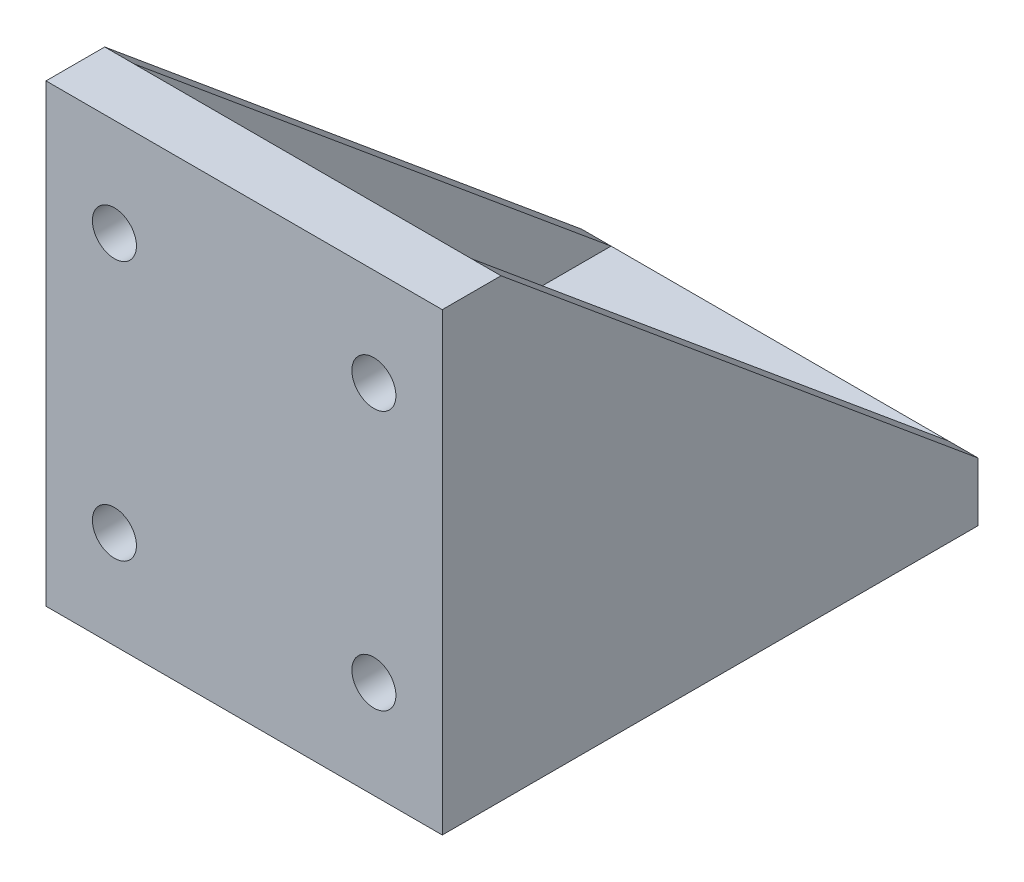
ISO-10303-21;
HEADER;
FILE_DESCRIPTION(('STEP AP214'),'2;1');
FILE_NAME('part.step','',(''),(''),'','','');
FILE_SCHEMA(('AUTOMOTIVE_DESIGN { 1 0 10303 214 1 1 1 1 }'));
ENDSEC;
DATA;
#1=APPLICATION_CONTEXT('core data for automotive mechanical design processes');
#2=APPLICATION_PROTOCOL_DEFINITION('international standard','automotive_design',2000,#1);
#3=PRODUCT_CONTEXT('',#1,'mechanical');
#4=PRODUCT('Part','Part','',(#3));
#5=PRODUCT_RELATED_PRODUCT_CATEGORY('part','',(#4));
#6=PRODUCT_DEFINITION_FORMATION('','',#4);
#7=PRODUCT_DEFINITION_CONTEXT('part definition',#1,'design');
#8=PRODUCT_DEFINITION('design','',#6,#7);
#9=PRODUCT_DEFINITION_SHAPE('','',#8);
#10=(LENGTH_UNIT() NAMED_UNIT(*) SI_UNIT(.MILLI.,.METRE.));
#11=(NAMED_UNIT(*) PLANE_ANGLE_UNIT() SI_UNIT($,.RADIAN.));
#12=(NAMED_UNIT(*) SI_UNIT($,.STERADIAN.) SOLID_ANGLE_UNIT());
#13=UNCERTAINTY_MEASURE_WITH_UNIT(LENGTH_MEASURE(1.E-05),#10,'distance_accuracy_value','');
#14=(GEOMETRIC_REPRESENTATION_CONTEXT(3) GLOBAL_UNCERTAINTY_ASSIGNED_CONTEXT((#13)) GLOBAL_UNIT_ASSIGNED_CONTEXT((#10,
#11,#12)) REPRESENTATION_CONTEXT('',''));
#15=CARTESIAN_POINT('',(0.,0.,0.));
#16=DIRECTION('',(0.,0.,1.));
#17=DIRECTION('',(1.,0.,0.));
#18=AXIS2_PLACEMENT_3D('',#15,#16,#17);
#19=CARTESIAN_POINT('',(-27.,-23.,-73.));
#20=DIRECTION('',(0.,0.769190373051951,-0.639019694535466));
#21=DIRECTION('',(0.,0.639019694535466,0.769190373051951));
#22=AXIS2_PLACEMENT_3D('',#19,#20,#21);
#23=PLANE('',#22);
#24=DIRECTION('',(0.,0.639019694535466,0.769190373051951));
#25=VECTOR('',#24,1.);
#26=CARTESIAN_POINT('',(-23.,-23.,-73.));
#27=LINE('',#26,#25);
#28=CARTESIAN_POINT('',(-23.,-23.,-73.));
#29=VERTEX_POINT('',#28);
#30=CARTESIAN_POINT('',(-23.,31.,-8.));
#31=VERTEX_POINT('',#30);
#32=EDGE_CURVE('E11',#29,#31,#27,.T.);
#33=ORIENTED_EDGE('',*,*,#32,.F.);
#34=DIRECTION('',(1.,0.,0.));
#35=VECTOR('',#34,1.);
#36=CARTESIAN_POINT('',(-27.,-23.,-73.));
#37=LINE('',#36,#35);
#38=CARTESIAN_POINT('',(-27.,-23.,-73.));
#39=VERTEX_POINT('',#38);
#40=EDGE_CURVE('E130',#39,#29,#37,.T.);
#41=ORIENTED_EDGE('',*,*,#40,.F.);
#42=DIRECTION('',(0.,0.639019694535466,0.769190373051951));
#43=VECTOR('',#42,1.);
#44=CARTESIAN_POINT('',(-27.,-23.,-73.));
#45=LINE('',#44,#43);
#46=CARTESIAN_POINT('',(-27.,31.,-7.99999999999999));
#47=VERTEX_POINT('',#46);
#48=EDGE_CURVE('E155',#39,#47,#45,.T.);
#49=ORIENTED_EDGE('',*,*,#48,.T.);
#50=DIRECTION('',(1.,0.,0.));
#51=VECTOR('',#50,1.);
#52=CARTESIAN_POINT('',(-27.,31.,-7.99999999999999));
#53=LINE('',#52,#51);
#54=EDGE_CURVE('E69',#47,#31,#53,.T.);
#55=ORIENTED_EDGE('',*,*,#54,.T.);
#56=EDGE_LOOP('',(#33,#41,#49,#55));
#57=FACE_BOUND('',#56,.T.);
#58=ADVANCED_FACE('F43',(#57),#23,.T.);
#59=CARTESIAN_POINT('',(-27.,31.,-7.99999999999999));
#60=DIRECTION('',(0.,1.,0.));
#61=DIRECTION('',(0.,0.,1.));
#62=AXIS2_PLACEMENT_3D('',#59,#60,#61);
#63=PLANE('',#62);
#64=DIRECTION('',(1.,0.,0.));
#65=VECTOR('',#64,1.);
#66=CARTESIAN_POINT('',(-27.,31.,0.));
#67=LINE('',#66,#65);
#68=CARTESIAN_POINT('',(-27.,31.,0.));
#69=VERTEX_POINT('',#68);
#70=CARTESIAN_POINT('',(27.,31.,0.));
#71=VERTEX_POINT('',#70);
#72=EDGE_CURVE('E152',#69,#71,#67,.T.);
#73=ORIENTED_EDGE('',*,*,#72,.T.);
#74=DIRECTION('',(0.,0.,1.));
#75=VECTOR('',#74,1.);
#76=CARTESIAN_POINT('',(27.,31.,-7.99999999999999));
#77=LINE('',#76,#75);
#78=CARTESIAN_POINT('',(27.,31.,-7.99999999999999));
#79=VERTEX_POINT('',#78);
#80=EDGE_CURVE('E220',#79,#71,#77,.T.);
#81=ORIENTED_EDGE('',*,*,#80,.F.);
#82=CARTESIAN_POINT('',(23.,31.,-8.));
#83=VERTEX_POINT('',#82);
#84=EDGE_CURVE('E137',#83,#79,#53,.T.);
#85=ORIENTED_EDGE('',*,*,#84,.F.);
#86=DIRECTION('',(-1.,0.,0.));
#87=VECTOR('',#86,1.);
#88=CARTESIAN_POINT('',(-23.,31.,-8.));
#89=LINE('',#88,#87);
#90=EDGE_CURVE('E126',#83,#31,#89,.T.);
#91=ORIENTED_EDGE('',*,*,#90,.T.);
#92=ORIENTED_EDGE('',*,*,#54,.F.);
#93=DIRECTION('',(0.,0.,1.));
#94=VECTOR('',#93,1.);
#95=CARTESIAN_POINT('',(-27.,31.,-7.99999999999999));
#96=LINE('',#95,#94);
#97=EDGE_CURVE('E241',#47,#69,#96,.T.);
#98=ORIENTED_EDGE('',*,*,#97,.T.);
#99=EDGE_LOOP('',(#73,#81,#85,#91,#92,#98));
#100=FACE_BOUND('',#99,.T.);
#101=ADVANCED_FACE('F45',(#100),#63,.T.);
#102=DIRECTION('',(0.,-0.639019694535466,-0.769190373051951));
#103=VECTOR('',#102,1.);
#104=CARTESIAN_POINT('',(23.,-23.,-73.));
#105=LINE('',#104,#103);
#106=CARTESIAN_POINT('',(23.,-23.,-73.));
#107=VERTEX_POINT('',#106);
#108=EDGE_CURVE('E53',#83,#107,#105,.T.);
#109=ORIENTED_EDGE('',*,*,#108,.F.);
#110=ORIENTED_EDGE('',*,*,#84,.T.);
#111=DIRECTION('',(0.,0.639019694535466,0.769190373051951));
#112=VECTOR('',#111,1.);
#113=CARTESIAN_POINT('',(27.,-23.,-73.));
#114=LINE('',#113,#112);
#115=CARTESIAN_POINT('',(27.,-23.,-73.));
#116=VERTEX_POINT('',#115);
#117=EDGE_CURVE('E237',#116,#79,#114,.T.);
#118=ORIENTED_EDGE('',*,*,#117,.F.);
#119=EDGE_CURVE('E138',#107,#116,#37,.T.);
#120=ORIENTED_EDGE('',*,*,#119,.F.);
#121=EDGE_LOOP('',(#109,#110,#118,#120));
#122=FACE_BOUND('',#121,.T.);
#123=ADVANCED_FACE('F269',(#122),#23,.T.);
#124=CARTESIAN_POINT('',(-27.,-31.,-73.));
#125=DIRECTION('',(0.,0.,-1.));
#126=DIRECTION('',(-1.,0.,0.));
#127=AXIS2_PLACEMENT_3D('',#124,#125,#126);
#128=PLANE('',#127);
#129=ORIENTED_EDGE('',*,*,#40,.T.);
#130=DIRECTION('',(1.,0.,0.));
#131=VECTOR('',#130,1.);
#132=CARTESIAN_POINT('',(-23.,-23.,-73.));
#133=LINE('',#132,#131);
#134=EDGE_CURVE('E119',#29,#107,#133,.T.);
#135=ORIENTED_EDGE('',*,*,#134,.T.);
#136=ORIENTED_EDGE('',*,*,#119,.T.);
#137=DIRECTION('',(0.,1.,0.));
#138=VECTOR('',#137,1.);
#139=CARTESIAN_POINT('',(27.,-31.,-73.));
#140=LINE('',#139,#138);
#141=CARTESIAN_POINT('',(27.,-31.,-73.));
#142=VERTEX_POINT('',#141);
#143=EDGE_CURVE('E233',#142,#116,#140,.T.);
#144=ORIENTED_EDGE('',*,*,#143,.F.);
#145=DIRECTION('',(1.,0.,0.));
#146=VECTOR('',#145,1.);
#147=CARTESIAN_POINT('',(-27.,-31.,-73.));
#148=LINE('',#147,#146);
#149=CARTESIAN_POINT('',(-27.,-31.,-73.));
#150=VERTEX_POINT('',#149);
#151=EDGE_CURVE('E144',#150,#142,#148,.T.);
#152=ORIENTED_EDGE('',*,*,#151,.F.);
#153=DIRECTION('',(0.,1.,0.));
#154=VECTOR('',#153,1.);
#155=CARTESIAN_POINT('',(-27.,-31.,-73.));
#156=LINE('',#155,#154);
#157=EDGE_CURVE('E134',#150,#39,#156,.T.);
#158=ORIENTED_EDGE('',*,*,#157,.T.);
#159=EDGE_LOOP('',(#129,#135,#136,#144,#152,#158));
#160=FACE_BOUND('',#159,.T.);
#161=ADVANCED_FACE('F132',(#160),#128,.T.);
#162=CARTESIAN_POINT('',(-27.,-31.,-73.));
#163=DIRECTION('',(0.,-1.,0.));
#164=DIRECTION('',(0.,0.,-1.));
#165=AXIS2_PLACEMENT_3D('',#162,#163,#164);
#166=PLANE('',#165);
#167=CARTESIAN_POINT('',(0.,-31.,-14.));
#168=DIRECTION('',(0.,1.,0.));
#169=DIRECTION('',(0.,0.,-1.));
#170=AXIS2_PLACEMENT_3D('',#167,#168,#169);
#171=CIRCLE('',#170,2.);
#172=CARTESIAN_POINT('',(0.,-31.,-16.));
#173=VERTEX_POINT('',#172);
#174=EDGE_CURVE('E180',#173,#173,#171,.T.);
#175=ORIENTED_EDGE('',*,*,#174,.T.);
#176=EDGE_LOOP('',(#175));
#177=FACE_BOUND('',#176,.T.);
#178=CARTESIAN_POINT('',(0.,-31.,-59.));
#179=DIRECTION('',(0.,1.,0.));
#180=DIRECTION('',(0.,0.,-1.));
#181=AXIS2_PLACEMENT_3D('',#178,#179,#180);
#182=CIRCLE('',#181,2.);
#183=CARTESIAN_POINT('',(0.,-31.,-61.));
#184=VERTEX_POINT('',#183);
#185=EDGE_CURVE('E353',#184,#184,#182,.T.);
#186=ORIENTED_EDGE('',*,*,#185,.T.);
#187=EDGE_LOOP('',(#186));
#188=FACE_BOUND('',#187,.T.);
#189=CARTESIAN_POINT('',(18.,-31.,-36.5));
#190=DIRECTION('',(0.,1.,0.));
#191=DIRECTION('',(0.,0.,-1.));
#192=AXIS2_PLACEMENT_3D('',#189,#190,#191);
#193=CIRCLE('',#192,2.);
#194=CARTESIAN_POINT('',(18.,-31.,-38.5));
#195=VERTEX_POINT('',#194);
#196=EDGE_CURVE('E357',#195,#195,#193,.T.);
#197=ORIENTED_EDGE('',*,*,#196,.T.);
#198=EDGE_LOOP('',(#197));
#199=FACE_BOUND('',#198,.T.);
#200=CARTESIAN_POINT('',(-18.,-31.,-36.5));
#201=DIRECTION('',(0.,1.,0.));
#202=DIRECTION('',(0.,0.,-1.));
#203=AXIS2_PLACEMENT_3D('',#200,#201,#202);
#204=CIRCLE('',#203,2.);
#205=CARTESIAN_POINT('',(-18.,-31.,-38.5));
#206=VERTEX_POINT('',#205);
#207=EDGE_CURVE('E363',#206,#206,#204,.T.);
#208=ORIENTED_EDGE('',*,*,#207,.T.);
#209=EDGE_LOOP('',(#208));
#210=FACE_BOUND('',#209,.T.);
#211=ORIENTED_EDGE('',*,*,#151,.T.);
#212=DIRECTION('',(0.,0.,-1.));
#213=VECTOR('',#212,1.);
#214=CARTESIAN_POINT('',(27.,-31.,-73.));
#215=LINE('',#214,#213);
#216=CARTESIAN_POINT('',(27.,-31.,0.));
#217=VERTEX_POINT('',#216);
#218=EDGE_CURVE('E229',#217,#142,#215,.T.);
#219=ORIENTED_EDGE('',*,*,#218,.F.);
#220=DIRECTION('',(1.,0.,0.));
#221=VECTOR('',#220,1.);
#222=CARTESIAN_POINT('',(-27.,-31.,0.));
#223=LINE('',#222,#221);
#224=CARTESIAN_POINT('',(-27.,-31.,0.));
#225=VERTEX_POINT('',#224);
#226=EDGE_CURVE('E149',#225,#217,#223,.T.);
#227=ORIENTED_EDGE('',*,*,#226,.F.);
#228=DIRECTION('',(0.,0.,-1.));
#229=VECTOR('',#228,1.);
#230=CARTESIAN_POINT('',(-27.,-31.,-73.));
#231=LINE('',#230,#229);
#232=EDGE_CURVE('E248',#225,#150,#231,.T.);
#233=ORIENTED_EDGE('',*,*,#232,.T.);
#234=EDGE_LOOP('',(#211,#219,#227,#233));
#235=FACE_BOUND('',#234,.T.);
#236=ADVANCED_FACE('F294',(#177,#188,#199,#210,#235),#166,.T.);
#237=CARTESIAN_POINT('',(-27.,31.,0.));
#238=DIRECTION('',(0.,0.,1.));
#239=DIRECTION('',(0.,-1.,0.));
#240=AXIS2_PLACEMENT_3D('',#237,#238,#239);
#241=PLANE('',#240);
#242=CARTESIAN_POINT('',(17.6776695296636,17.6776695296638,0.));
#243=DIRECTION('',(0.,0.,-1.));
#244=DIRECTION('',(-1.,0.,0.));
#245=AXIS2_PLACEMENT_3D('',#242,#243,#244);
#246=CIRCLE('',#245,3.);
#247=CARTESIAN_POINT('',(14.6776695296636,17.6776695296638,0.));
#248=VERTEX_POINT('',#247);
#249=EDGE_CURVE('E192',#248,#248,#246,.T.);
#250=ORIENTED_EDGE('',*,*,#249,.T.);
#251=EDGE_LOOP('',(#250));
#252=FACE_BOUND('',#251,.T.);
#253=CARTESIAN_POINT('',(17.6776695296638,-17.6776695296636,0.));
#254=DIRECTION('',(0.,0.,-1.));
#255=DIRECTION('',(-1.,0.,0.));
#256=AXIS2_PLACEMENT_3D('',#253,#254,#255);
#257=CIRCLE('',#256,2.99999999999999);
#258=CARTESIAN_POINT('',(14.6776695296638,-17.6776695296636,0.));
#259=VERTEX_POINT('',#258);
#260=EDGE_CURVE('E197',#259,#259,#257,.T.);
#261=ORIENTED_EDGE('',*,*,#260,.T.);
#262=EDGE_LOOP('',(#261));
#263=FACE_BOUND('',#262,.T.);
#264=CARTESIAN_POINT('',(-17.6776695296636,-17.6776695296638,0.));
#265=DIRECTION('',(0.,0.,-1.));
#266=DIRECTION('',(-1.,0.,0.));
#267=AXIS2_PLACEMENT_3D('',#264,#265,#266);
#268=CIRCLE('',#267,3.);
#269=CARTESIAN_POINT('',(-20.6776695296636,-17.6776695296638,0.));
#270=VERTEX_POINT('',#269);
#271=EDGE_CURVE('E204',#270,#270,#268,.T.);
#272=ORIENTED_EDGE('',*,*,#271,.T.);
#273=EDGE_LOOP('',(#272));
#274=FACE_BOUND('',#273,.T.);
#275=CARTESIAN_POINT('',(-17.6776695296638,17.6776695296636,0.));
#276=DIRECTION('',(0.,0.,-1.));
#277=DIRECTION('',(-1.,0.,0.));
#278=AXIS2_PLACEMENT_3D('',#275,#276,#277);
#279=CIRCLE('',#278,3.);
#280=CARTESIAN_POINT('',(-20.6776695296638,17.6776695296636,0.));
#281=VERTEX_POINT('',#280);
#282=EDGE_CURVE('E163',#281,#281,#279,.T.);
#283=ORIENTED_EDGE('',*,*,#282,.T.);
#284=EDGE_LOOP('',(#283));
#285=FACE_BOUND('',#284,.T.);
#286=ORIENTED_EDGE('',*,*,#226,.T.);
#287=DIRECTION('',(0.,-1.,0.));
#288=VECTOR('',#287,1.);
#289=CARTESIAN_POINT('',(27.,31.,0.));
#290=LINE('',#289,#288);
#291=EDGE_CURVE('E225',#71,#217,#290,.T.);
#292=ORIENTED_EDGE('',*,*,#291,.F.);
#293=ORIENTED_EDGE('',*,*,#72,.F.);
#294=DIRECTION('',(0.,-1.,0.));
#295=VECTOR('',#294,1.);
#296=CARTESIAN_POINT('',(-27.,31.,0.));
#297=LINE('',#296,#295);
#298=EDGE_CURVE('E244',#69,#225,#297,.T.);
#299=ORIENTED_EDGE('',*,*,#298,.T.);
#300=EDGE_LOOP('',(#286,#292,#293,#299));
#301=FACE_BOUND('',#300,.T.);
#302=ADVANCED_FACE('F260',(#252,#263,#274,#285,#301),#241,.T.);
#303=CARTESIAN_POINT('',(-27.,0.,0.));
#304=DIRECTION('',(1.,0.,0.));
#305=DIRECTION('',(0.,0.,-1.));
#306=AXIS2_PLACEMENT_3D('',#303,#304,#305);
#307=PLANE('',#306);
#308=ORIENTED_EDGE('',*,*,#97,.F.);
#309=ORIENTED_EDGE('',*,*,#48,.F.);
#310=ORIENTED_EDGE('',*,*,#157,.F.);
#311=ORIENTED_EDGE('',*,*,#232,.F.);
#312=ORIENTED_EDGE('',*,*,#298,.F.);
#313=EDGE_LOOP('',(#308,#309,#310,#311,#312));
#314=FACE_BOUND('',#313,.T.);
#315=ADVANCED_FACE('F253',(#314),#307,.F.);
#316=CARTESIAN_POINT('',(27.,0.,0.));
#317=DIRECTION('',(1.,0.,0.));
#318=DIRECTION('',(0.,0.,-1.));
#319=AXIS2_PLACEMENT_3D('',#316,#317,#318);
#320=PLANE('',#319);
#321=ORIENTED_EDGE('',*,*,#80,.T.);
#322=ORIENTED_EDGE('',*,*,#291,.T.);
#323=ORIENTED_EDGE('',*,*,#218,.T.);
#324=ORIENTED_EDGE('',*,*,#143,.T.);
#325=ORIENTED_EDGE('',*,*,#117,.T.);
#326=EDGE_LOOP('',(#321,#322,#323,#324,#325));
#327=FACE_BOUND('',#326,.T.);
#328=ADVANCED_FACE('F263',(#327),#320,.T.);
#329=CARTESIAN_POINT('',(-23.,31.,-73.));
#330=DIRECTION('',(-1.,0.,0.));
#331=DIRECTION('',(0.,-1.,0.));
#332=AXIS2_PLACEMENT_3D('',#329,#330,#331);
#333=PLANE('',#332);
#334=ORIENTED_EDGE('',*,*,#32,.T.);
#335=DIRECTION('',(0.,-1.,0.));
#336=VECTOR('',#335,1.);
#337=CARTESIAN_POINT('',(-23.,31.,-8.));
#338=LINE('',#337,#336);
#339=CARTESIAN_POINT('',(-23.,-23.,-8.));
#340=VERTEX_POINT('',#339);
#341=EDGE_CURVE('E116',#31,#340,#338,.T.);
#342=ORIENTED_EDGE('',*,*,#341,.T.);
#343=DIRECTION('',(0.,0.,1.));
#344=VECTOR('',#343,1.);
#345=CARTESIAN_POINT('',(-23.,-23.,-73.));
#346=LINE('',#345,#344);
#347=EDGE_CURVE('E112',#29,#340,#346,.T.);
#348=ORIENTED_EDGE('',*,*,#347,.F.);
#349=EDGE_LOOP('',(#334,#342,#348));
#350=FACE_BOUND('',#349,.T.);
#351=ADVANCED_FACE('F113',(#350),#333,.F.);
#352=CARTESIAN_POINT('',(23.,31.,-73.));
#353=DIRECTION('',(1.,0.,0.));
#354=DIRECTION('',(0.,1.,0.));
#355=AXIS2_PLACEMENT_3D('',#352,#353,#354);
#356=PLANE('',#355);
#357=ORIENTED_EDGE('',*,*,#108,.T.);
#358=DIRECTION('',(0.,0.,1.));
#359=VECTOR('',#358,1.);
#360=CARTESIAN_POINT('',(23.,-23.,-73.));
#361=LINE('',#360,#359);
#362=CARTESIAN_POINT('',(23.,-23.,-8.));
#363=VERTEX_POINT('',#362);
#364=EDGE_CURVE('E61',#107,#363,#361,.T.);
#365=ORIENTED_EDGE('',*,*,#364,.T.);
#366=DIRECTION('',(0.,1.,0.));
#367=VECTOR('',#366,1.);
#368=CARTESIAN_POINT('',(23.,31.,-8.));
#369=LINE('',#368,#367);
#370=EDGE_CURVE('E215',#363,#83,#369,.T.);
#371=ORIENTED_EDGE('',*,*,#370,.T.);
#372=EDGE_LOOP('',(#357,#365,#371));
#373=FACE_BOUND('',#372,.T.);
#374=ADVANCED_FACE('F275',(#373),#356,.F.);
#375=CARTESIAN_POINT('',(-23.,-23.,-73.));
#376=DIRECTION('',(0.,-1.,0.));
#377=DIRECTION('',(0.,0.,-1.));
#378=AXIS2_PLACEMENT_3D('',#375,#376,#377);
#379=PLANE('',#378);
#380=CARTESIAN_POINT('',(0.,-23.,-14.));
#381=DIRECTION('',(0.,-1.,0.));
#382=DIRECTION('',(0.,0.,-1.));
#383=AXIS2_PLACEMENT_3D('',#380,#381,#382);
#384=CIRCLE('',#383,2.);
#385=CARTESIAN_POINT('',(0.,-23.,-16.));
#386=VERTEX_POINT('',#385);
#387=EDGE_CURVE('E47',#386,#386,#384,.F.);
#388=ORIENTED_EDGE('',*,*,#387,.F.);
#389=EDGE_LOOP('',(#388));
#390=FACE_BOUND('',#389,.T.);
#391=CARTESIAN_POINT('',(0.,-23.,-59.));
#392=DIRECTION('',(0.,-1.,0.));
#393=DIRECTION('',(0.,0.,-1.));
#394=AXIS2_PLACEMENT_3D('',#391,#392,#393);
#395=CIRCLE('',#394,2.);
#396=CARTESIAN_POINT('',(0.,-23.,-61.));
#397=VERTEX_POINT('',#396);
#398=EDGE_CURVE('E183',#397,#397,#395,.F.);
#399=ORIENTED_EDGE('',*,*,#398,.F.);
#400=EDGE_LOOP('',(#399));
#401=FACE_BOUND('',#400,.T.);
#402=CARTESIAN_POINT('',(18.,-23.,-36.5));
#403=DIRECTION('',(0.,-1.,0.));
#404=DIRECTION('',(0.,0.,-1.));
#405=AXIS2_PLACEMENT_3D('',#402,#403,#404);
#406=CIRCLE('',#405,2.);
#407=CARTESIAN_POINT('',(18.,-23.,-38.5));
#408=VERTEX_POINT('',#407);
#409=EDGE_CURVE('E179',#408,#408,#406,.F.);
#410=ORIENTED_EDGE('',*,*,#409,.F.);
#411=EDGE_LOOP('',(#410));
#412=FACE_BOUND('',#411,.T.);
#413=CARTESIAN_POINT('',(-18.,-23.,-36.5));
#414=DIRECTION('',(0.,-1.,0.));
#415=DIRECTION('',(0.,0.,-1.));
#416=AXIS2_PLACEMENT_3D('',#413,#414,#415);
#417=CIRCLE('',#416,2.);
#418=CARTESIAN_POINT('',(-18.,-23.,-38.5));
#419=VERTEX_POINT('',#418);
#420=EDGE_CURVE('E175',#419,#419,#417,.F.);
#421=ORIENTED_EDGE('',*,*,#420,.F.);
#422=EDGE_LOOP('',(#421));
#423=FACE_BOUND('',#422,.T.);
#424=DIRECTION('',(1.,0.,0.));
#425=VECTOR('',#424,1.);
#426=CARTESIAN_POINT('',(-23.,-23.,-8.));
#427=LINE('',#426,#425);
#428=EDGE_CURVE('E212',#340,#363,#427,.T.);
#429=ORIENTED_EDGE('',*,*,#428,.T.);
#430=ORIENTED_EDGE('',*,*,#364,.F.);
#431=ORIENTED_EDGE('',*,*,#134,.F.);
#432=ORIENTED_EDGE('',*,*,#347,.T.);
#433=EDGE_LOOP('',(#429,#430,#431,#432));
#434=FACE_BOUND('',#433,.T.);
#435=ADVANCED_FACE('F122',(#390,#401,#412,#423,#434),#379,.F.);
#436=CARTESIAN_POINT('',(0.,0.,-8.));
#437=DIRECTION('',(0.,0.,1.));
#438=DIRECTION('',(1.,0.,0.));
#439=AXIS2_PLACEMENT_3D('',#436,#437,#438);
#440=PLANE('',#439);
#441=CARTESIAN_POINT('',(17.6776695296636,17.6776695296638,-8.00000000000001));
#442=DIRECTION('',(0.,0.,1.));
#443=DIRECTION('',(1.,0.,0.));
#444=AXIS2_PLACEMENT_3D('',#441,#442,#443);
#445=CIRCLE('',#444,3.);
#446=CARTESIAN_POINT('',(20.6776695296636,17.6776695296638,-8.00000000000001));
#447=VERTEX_POINT('',#446);
#448=EDGE_CURVE('E171',#447,#447,#445,.F.);
#449=ORIENTED_EDGE('',*,*,#448,.F.);
#450=EDGE_LOOP('',(#449));
#451=FACE_BOUND('',#450,.T.);
#452=CARTESIAN_POINT('',(17.6776695296638,-17.6776695296636,-8.00000000000001));
#453=DIRECTION('',(0.,0.,1.));
#454=DIRECTION('',(1.,0.,0.));
#455=AXIS2_PLACEMENT_3D('',#452,#453,#454);
#456=CIRCLE('',#455,2.99999999999999);
#457=CARTESIAN_POINT('',(20.6776695296638,-17.6776695296636,-8.00000000000001));
#458=VERTEX_POINT('',#457);
#459=EDGE_CURVE('E167',#458,#458,#456,.F.);
#460=ORIENTED_EDGE('',*,*,#459,.F.);
#461=EDGE_LOOP('',(#460));
#462=FACE_BOUND('',#461,.T.);
#463=CARTESIAN_POINT('',(-17.6776695296636,-17.6776695296638,-8.00000000000001));
#464=DIRECTION('',(0.,0.,1.));
#465=DIRECTION('',(1.,0.,0.));
#466=AXIS2_PLACEMENT_3D('',#463,#464,#465);
#467=CIRCLE('',#466,3.);
#468=CARTESIAN_POINT('',(-14.6776695296636,-17.6776695296638,-8.00000000000001));
#469=VERTEX_POINT('',#468);
#470=EDGE_CURVE('E162',#469,#469,#467,.F.);
#471=ORIENTED_EDGE('',*,*,#470,.F.);
#472=EDGE_LOOP('',(#471));
#473=FACE_BOUND('',#472,.T.);
#474=CARTESIAN_POINT('',(-17.6776695296638,17.6776695296636,-8.00000000000001));
#475=DIRECTION('',(0.,0.,1.));
#476=DIRECTION('',(1.,0.,0.));
#477=AXIS2_PLACEMENT_3D('',#474,#475,#476);
#478=CIRCLE('',#477,3.);
#479=CARTESIAN_POINT('',(-14.6776695296638,17.6776695296636,-8.00000000000001));
#480=VERTEX_POINT('',#479);
#481=EDGE_CURVE('E158',#480,#480,#478,.F.);
#482=ORIENTED_EDGE('',*,*,#481,.F.);
#483=EDGE_LOOP('',(#482));
#484=FACE_BOUND('',#483,.T.);
#485=ORIENTED_EDGE('',*,*,#341,.F.);
#486=ORIENTED_EDGE('',*,*,#90,.F.);
#487=ORIENTED_EDGE('',*,*,#370,.F.);
#488=ORIENTED_EDGE('',*,*,#428,.F.);
#489=EDGE_LOOP('',(#485,#486,#487,#488));
#490=FACE_BOUND('',#489,.T.);
#491=ADVANCED_FACE('F273',(#451,#462,#473,#484,#490),#440,.F.);
#492=CARTESIAN_POINT('',(-17.6776695296638,17.6776695296636,-73.));
#493=DIRECTION('',(0.,0.,1.));
#494=DIRECTION('',(1.,0.,0.));
#495=AXIS2_PLACEMENT_3D('',#492,#493,#494);
#496=CYLINDRICAL_SURFACE('',#495,3.);
#497=ORIENTED_EDGE('',*,*,#282,.F.);
#498=EDGE_LOOP('',(#497));
#499=FACE_BOUND('',#498,.T.);
#500=ORIENTED_EDGE('',*,*,#481,.T.);
#501=EDGE_LOOP('',(#500));
#502=FACE_BOUND('',#501,.T.);
#503=ADVANCED_FACE('F310',(#499,#502),#496,.F.);
#504=CARTESIAN_POINT('',(-17.6776695296636,-17.6776695296638,-73.));
#505=DIRECTION('',(0.,0.,1.));
#506=DIRECTION('',(1.,0.,0.));
#507=AXIS2_PLACEMENT_3D('',#504,#505,#506);
#508=CYLINDRICAL_SURFACE('',#507,3.);
#509=ORIENTED_EDGE('',*,*,#271,.F.);
#510=EDGE_LOOP('',(#509));
#511=FACE_BOUND('',#510,.T.);
#512=ORIENTED_EDGE('',*,*,#470,.T.);
#513=EDGE_LOOP('',(#512));
#514=FACE_BOUND('',#513,.T.);
#515=ADVANCED_FACE('F313',(#511,#514),#508,.F.);
#516=CARTESIAN_POINT('',(17.6776695296638,-17.6776695296636,-73.));
#517=DIRECTION('',(0.,0.,1.));
#518=DIRECTION('',(1.,0.,0.));
#519=AXIS2_PLACEMENT_3D('',#516,#517,#518);
#520=CYLINDRICAL_SURFACE('',#519,2.99999999999999);
#521=ORIENTED_EDGE('',*,*,#260,.F.);
#522=EDGE_LOOP('',(#521));
#523=FACE_BOUND('',#522,.T.);
#524=ORIENTED_EDGE('',*,*,#459,.T.);
#525=EDGE_LOOP('',(#524));
#526=FACE_BOUND('',#525,.T.);
#527=ADVANCED_FACE('F327',(#523,#526),#520,.F.);
#528=CARTESIAN_POINT('',(17.6776695296636,17.6776695296638,-73.));
#529=DIRECTION('',(0.,0.,1.));
#530=DIRECTION('',(1.,0.,0.));
#531=AXIS2_PLACEMENT_3D('',#528,#529,#530);
#532=CYLINDRICAL_SURFACE('',#531,3.);
#533=ORIENTED_EDGE('',*,*,#249,.F.);
#534=EDGE_LOOP('',(#533));
#535=FACE_BOUND('',#534,.T.);
#536=ORIENTED_EDGE('',*,*,#448,.T.);
#537=EDGE_LOOP('',(#536));
#538=FACE_BOUND('',#537,.T.);
#539=ADVANCED_FACE('F323',(#535,#538),#532,.F.);
#540=CARTESIAN_POINT('',(-18.,-21.,-36.5));
#541=DIRECTION('',(0.,-1.,0.));
#542=DIRECTION('',(0.,0.,-1.));
#543=AXIS2_PLACEMENT_3D('',#540,#541,#542);
#544=CYLINDRICAL_SURFACE('',#543,2.);
#545=ORIENTED_EDGE('',*,*,#207,.F.);
#546=EDGE_LOOP('',(#545));
#547=FACE_BOUND('',#546,.T.);
#548=ORIENTED_EDGE('',*,*,#420,.T.);
#549=EDGE_LOOP('',(#548));
#550=FACE_BOUND('',#549,.T.);
#551=ADVANCED_FACE('F326',(#547,#550),#544,.F.);
#552=CARTESIAN_POINT('',(18.,-21.,-36.5));
#553=DIRECTION('',(0.,-1.,0.));
#554=DIRECTION('',(0.,0.,-1.));
#555=AXIS2_PLACEMENT_3D('',#552,#553,#554);
#556=CYLINDRICAL_SURFACE('',#555,2.);
#557=ORIENTED_EDGE('',*,*,#196,.F.);
#558=EDGE_LOOP('',(#557));
#559=FACE_BOUND('',#558,.T.);
#560=ORIENTED_EDGE('',*,*,#409,.T.);
#561=EDGE_LOOP('',(#560));
#562=FACE_BOUND('',#561,.T.);
#563=ADVANCED_FACE('F337',(#559,#562),#556,.F.);
#564=CARTESIAN_POINT('',(0.,-21.,-59.));
#565=DIRECTION('',(0.,-1.,0.));
#566=DIRECTION('',(0.,0.,-1.));
#567=AXIS2_PLACEMENT_3D('',#564,#565,#566);
#568=CYLINDRICAL_SURFACE('',#567,2.);
#569=ORIENTED_EDGE('',*,*,#185,.F.);
#570=EDGE_LOOP('',(#569));
#571=FACE_BOUND('',#570,.T.);
#572=ORIENTED_EDGE('',*,*,#398,.T.);
#573=EDGE_LOOP('',(#572));
#574=FACE_BOUND('',#573,.T.);
#575=ADVANCED_FACE('F341',(#571,#574),#568,.F.);
#576=CARTESIAN_POINT('',(0.,-21.,-14.));
#577=DIRECTION('',(0.,-1.,0.));
#578=DIRECTION('',(0.,0.,-1.));
#579=AXIS2_PLACEMENT_3D('',#576,#577,#578);
#580=CYLINDRICAL_SURFACE('',#579,2.);
#581=ORIENTED_EDGE('',*,*,#174,.F.);
#582=EDGE_LOOP('',(#581));
#583=FACE_BOUND('',#582,.T.);
#584=ORIENTED_EDGE('',*,*,#387,.T.);
#585=EDGE_LOOP('',(#584));
#586=FACE_BOUND('',#585,.T.);
#587=ADVANCED_FACE('F345',(#583,#586),#580,.F.);
#588=CLOSED_SHELL('',(#58,#101,#123,#161,#236,#302,#315,#328,#351,#374,#435,#491,#503,#515,#527,
#539,#551,#563,#575,#587));
#589=MANIFOLD_SOLID_BREP('B2',#588);
#590=ADVANCED_BREP_SHAPE_REPRESENTATION('',(#18,#589),#14);
#591=SHAPE_DEFINITION_REPRESENTATION(#9,#590);
ENDSEC;
END-ISO-10303-21;
